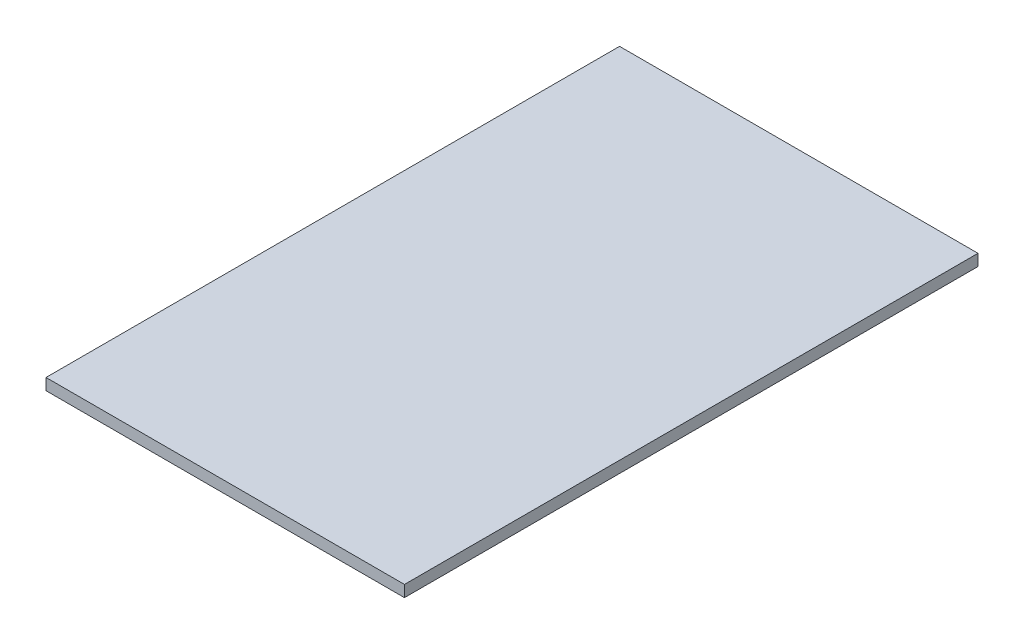
ISO-10303-21;
HEADER;
FILE_DESCRIPTION(('STEP AP214'),'2;1');
FILE_NAME('part.step','',(''),(''),'','','');
FILE_SCHEMA(('AUTOMOTIVE_DESIGN { 1 0 10303 214 1 1 1 1 }'));
ENDSEC;
DATA;
#1=APPLICATION_CONTEXT('core data for automotive mechanical design processes');
#2=APPLICATION_PROTOCOL_DEFINITION('international standard','automotive_design',2000,#1);
#3=PRODUCT_CONTEXT('',#1,'mechanical');
#4=PRODUCT('Part','Part','',(#3));
#5=PRODUCT_RELATED_PRODUCT_CATEGORY('part','',(#4));
#6=PRODUCT_DEFINITION_FORMATION('','',#4);
#7=PRODUCT_DEFINITION_CONTEXT('part definition',#1,'design');
#8=PRODUCT_DEFINITION('design','',#6,#7);
#9=PRODUCT_DEFINITION_SHAPE('','',#8);
#10=(LENGTH_UNIT() NAMED_UNIT(*) SI_UNIT(.MILLI.,.METRE.));
#11=(NAMED_UNIT(*) PLANE_ANGLE_UNIT() SI_UNIT($,.RADIAN.));
#12=(NAMED_UNIT(*) SI_UNIT($,.STERADIAN.) SOLID_ANGLE_UNIT());
#13=UNCERTAINTY_MEASURE_WITH_UNIT(LENGTH_MEASURE(1.E-05),#10,'distance_accuracy_value','');
#14=(GEOMETRIC_REPRESENTATION_CONTEXT(3) GLOBAL_UNCERTAINTY_ASSIGNED_CONTEXT((#13)) GLOBAL_UNIT_ASSIGNED_CONTEXT((#10,
#11,#12)) REPRESENTATION_CONTEXT('',''));
#15=CARTESIAN_POINT('',(0.,0.,0.));
#16=DIRECTION('',(0.,0.,1.));
#17=DIRECTION('',(1.,0.,0.));
#18=AXIS2_PLACEMENT_3D('',#15,#16,#17);
#19=CARTESIAN_POINT('',(0.,1.6,0.));
#20=DIRECTION('',(1.,0.,0.));
#21=DIRECTION('',(0.,0.,-1.));
#22=AXIS2_PLACEMENT_3D('',#19,#20,#21);
#23=PLANE('',#22);
#24=DIRECTION('',(0.,0.,1.));
#25=VECTOR('',#24,1.);
#26=CARTESIAN_POINT('',(0.,0.,0.));
#27=LINE('',#26,#25);
#28=CARTESIAN_POINT('',(0.,0.,-80.));
#29=VERTEX_POINT('',#28);
#30=CARTESIAN_POINT('',(0.,0.,0.));
#31=VERTEX_POINT('',#30);
#32=EDGE_CURVE('E98',#29,#31,#27,.T.);
#33=ORIENTED_EDGE('',*,*,#32,.T.);
#34=DIRECTION('',(0.,-1.,0.));
#35=VECTOR('',#34,1.);
#36=CARTESIAN_POINT('',(0.,1.6,0.));
#37=LINE('',#36,#35);
#38=CARTESIAN_POINT('',(0.,1.6,0.));
#39=VERTEX_POINT('',#38);
#40=EDGE_CURVE('E11',#39,#31,#37,.T.);
#41=ORIENTED_EDGE('',*,*,#40,.F.);
#42=DIRECTION('',(0.,0.,1.));
#43=VECTOR('',#42,1.);
#44=CARTESIAN_POINT('',(0.,1.6,0.));
#45=LINE('',#44,#43);
#46=CARTESIAN_POINT('',(0.,1.6,-80.));
#47=VERTEX_POINT('',#46);
#48=EDGE_CURVE('E86',#47,#39,#45,.T.);
#49=ORIENTED_EDGE('',*,*,#48,.F.);
#50=DIRECTION('',(0.,-1.,0.));
#51=VECTOR('',#50,1.);
#52=CARTESIAN_POINT('',(0.,1.6,-80.));
#53=LINE('',#52,#51);
#54=EDGE_CURVE('E94',#47,#29,#53,.T.);
#55=ORIENTED_EDGE('',*,*,#54,.T.);
#56=EDGE_LOOP('',(#33,#41,#49,#55));
#57=FACE_BOUND('',#56,.T.);
#58=ADVANCED_FACE('F35',(#57),#23,.F.);
#59=CARTESIAN_POINT('',(0.,1.6,0.));
#60=DIRECTION('',(0.,0.,-1.));
#61=DIRECTION('',(-1.,0.,0.));
#62=AXIS2_PLACEMENT_3D('',#59,#60,#61);
#63=PLANE('',#62);
#64=DIRECTION('',(1.,0.,0.));
#65=VECTOR('',#64,1.);
#66=CARTESIAN_POINT('',(0.,0.,0.));
#67=LINE('',#66,#65);
#68=CARTESIAN_POINT('',(50.,0.,0.));
#69=VERTEX_POINT('',#68);
#70=EDGE_CURVE('E90',#31,#69,#67,.T.);
#71=ORIENTED_EDGE('',*,*,#70,.T.);
#72=DIRECTION('',(0.,-1.,0.));
#73=VECTOR('',#72,1.);
#74=CARTESIAN_POINT('',(50.,1.6,0.));
#75=LINE('',#74,#73);
#76=CARTESIAN_POINT('',(50.,1.6,0.));
#77=VERTEX_POINT('',#76);
#78=EDGE_CURVE('E43',#77,#69,#75,.T.);
#79=ORIENTED_EDGE('',*,*,#78,.F.);
#80=DIRECTION('',(1.,0.,0.));
#81=VECTOR('',#80,1.);
#82=CARTESIAN_POINT('',(0.,1.6,0.));
#83=LINE('',#82,#81);
#84=EDGE_CURVE('E81',#39,#77,#83,.T.);
#85=ORIENTED_EDGE('',*,*,#84,.F.);
#86=ORIENTED_EDGE('',*,*,#40,.T.);
#87=EDGE_LOOP('',(#71,#79,#85,#86));
#88=FACE_BOUND('',#87,.T.);
#89=ADVANCED_FACE('F89',(#88),#63,.F.);
#90=CARTESIAN_POINT('',(50.,1.6,0.));
#91=DIRECTION('',(-1.,0.,0.));
#92=DIRECTION('',(0.,0.,1.));
#93=AXIS2_PLACEMENT_3D('',#90,#91,#92);
#94=PLANE('',#93);
#95=DIRECTION('',(0.,0.,-1.));
#96=VECTOR('',#95,1.);
#97=CARTESIAN_POINT('',(50.,0.,0.));
#98=LINE('',#97,#96);
#99=CARTESIAN_POINT('',(50.,0.,-80.));
#100=VERTEX_POINT('',#99);
#101=EDGE_CURVE('E68',#69,#100,#98,.T.);
#102=ORIENTED_EDGE('',*,*,#101,.T.);
#103=DIRECTION('',(0.,-1.,0.));
#104=VECTOR('',#103,1.);
#105=CARTESIAN_POINT('',(50.,1.6,-80.));
#106=LINE('',#105,#104);
#107=CARTESIAN_POINT('',(50.,1.6,-80.));
#108=VERTEX_POINT('',#107);
#109=EDGE_CURVE('E91',#108,#100,#106,.T.);
#110=ORIENTED_EDGE('',*,*,#109,.F.);
#111=DIRECTION('',(0.,0.,-1.));
#112=VECTOR('',#111,1.);
#113=CARTESIAN_POINT('',(50.,1.6,0.));
#114=LINE('',#113,#112);
#115=EDGE_CURVE('E84',#77,#108,#114,.T.);
#116=ORIENTED_EDGE('',*,*,#115,.F.);
#117=ORIENTED_EDGE('',*,*,#78,.T.);
#118=EDGE_LOOP('',(#102,#110,#116,#117));
#119=FACE_BOUND('',#118,.T.);
#120=ADVANCED_FACE('F92',(#119),#94,.F.);
#121=CARTESIAN_POINT('',(0.,1.6,-80.));
#122=DIRECTION('',(0.,0.,1.));
#123=DIRECTION('',(1.,0.,0.));
#124=AXIS2_PLACEMENT_3D('',#121,#122,#123);
#125=PLANE('',#124);
#126=DIRECTION('',(-1.,0.,0.));
#127=VECTOR('',#126,1.);
#128=CARTESIAN_POINT('',(0.,0.,-80.));
#129=LINE('',#128,#127);
#130=EDGE_CURVE('E74',#100,#29,#129,.T.);
#131=ORIENTED_EDGE('',*,*,#130,.T.);
#132=ORIENTED_EDGE('',*,*,#54,.F.);
#133=DIRECTION('',(-1.,0.,0.));
#134=VECTOR('',#133,1.);
#135=CARTESIAN_POINT('',(0.,1.6,-80.));
#136=LINE('',#135,#134);
#137=EDGE_CURVE('E51',#108,#47,#136,.T.);
#138=ORIENTED_EDGE('',*,*,#137,.F.);
#139=ORIENTED_EDGE('',*,*,#109,.T.);
#140=EDGE_LOOP('',(#131,#132,#138,#139));
#141=FACE_BOUND('',#140,.T.);
#142=ADVANCED_FACE('F105',(#141),#125,.F.);
#143=CARTESIAN_POINT('',(0.,1.6,0.));
#144=DIRECTION('',(0.,-1.,0.));
#145=DIRECTION('',(0.,0.,-1.));
#146=AXIS2_PLACEMENT_3D('',#143,#144,#145);
#147=PLANE('',#146);
#148=ORIENTED_EDGE('',*,*,#48,.T.);
#149=ORIENTED_EDGE('',*,*,#84,.T.);
#150=ORIENTED_EDGE('',*,*,#115,.T.);
#151=ORIENTED_EDGE('',*,*,#137,.T.);
#152=EDGE_LOOP('',(#148,#149,#150,#151));
#153=FACE_BOUND('',#152,.T.);
#154=ADVANCED_FACE('F82',(#153),#147,.F.);
#155=CARTESIAN_POINT('',(0.,0.,0.));
#156=DIRECTION('',(0.,-1.,0.));
#157=DIRECTION('',(0.,0.,-1.));
#158=AXIS2_PLACEMENT_3D('',#155,#156,#157);
#159=PLANE('',#158);
#160=ORIENTED_EDGE('',*,*,#32,.F.);
#161=ORIENTED_EDGE('',*,*,#130,.F.);
#162=ORIENTED_EDGE('',*,*,#101,.F.);
#163=ORIENTED_EDGE('',*,*,#70,.F.);
#164=EDGE_LOOP('',(#160,#161,#162,#163));
#165=FACE_BOUND('',#164,.T.);
#166=ADVANCED_FACE('F108',(#165),#159,.T.);
#167=CLOSED_SHELL('',(#58,#89,#120,#142,#154,#166));
#168=MANIFOLD_SOLID_BREP('B2',#167);
#169=ADVANCED_BREP_SHAPE_REPRESENTATION('',(#18,#168),#14);
#170=SHAPE_DEFINITION_REPRESENTATION(#9,#169);
ENDSEC;
END-ISO-10303-21;
